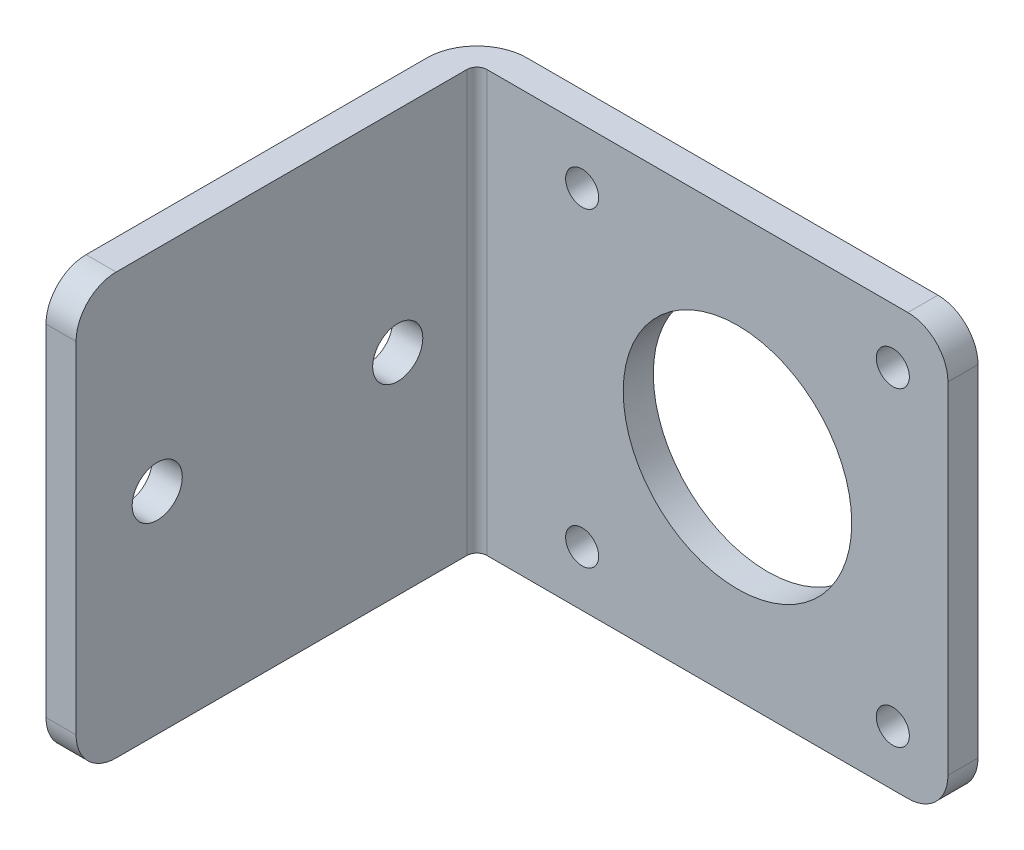
ISO-10303-21;
HEADER;
FILE_DESCRIPTION(('STEP AP214'),'2;1');
FILE_NAME('part.step','',(''),(''),'','','');
FILE_SCHEMA(('AUTOMOTIVE_DESIGN { 1 0 10303 214 1 1 1 1 }'));
ENDSEC;
DATA;
#1=APPLICATION_CONTEXT('core data for automotive mechanical design processes');
#2=APPLICATION_PROTOCOL_DEFINITION('international standard','automotive_design',2000,#1);
#3=PRODUCT_CONTEXT('',#1,'mechanical');
#4=PRODUCT('Part','Part','',(#3));
#5=PRODUCT_RELATED_PRODUCT_CATEGORY('part','',(#4));
#6=PRODUCT_DEFINITION_FORMATION('','',#4);
#7=PRODUCT_DEFINITION_CONTEXT('part definition',#1,'design');
#8=PRODUCT_DEFINITION('design','',#6,#7);
#9=PRODUCT_DEFINITION_SHAPE('','',#8);
#10=(LENGTH_UNIT() NAMED_UNIT(*) SI_UNIT(.MILLI.,.METRE.));
#11=(NAMED_UNIT(*) PLANE_ANGLE_UNIT() SI_UNIT($,.RADIAN.));
#12=(NAMED_UNIT(*) SI_UNIT($,.STERADIAN.) SOLID_ANGLE_UNIT());
#13=UNCERTAINTY_MEASURE_WITH_UNIT(LENGTH_MEASURE(1.E-05),#10,'distance_accuracy_value','');
#14=(GEOMETRIC_REPRESENTATION_CONTEXT(3) GLOBAL_UNCERTAINTY_ASSIGNED_CONTEXT((#13)) GLOBAL_UNIT_ASSIGNED_CONTEXT((#10,
#11,#12)) REPRESENTATION_CONTEXT('',''));
#15=CARTESIAN_POINT('',(0.,0.,0.));
#16=DIRECTION('',(0.,0.,1.));
#17=DIRECTION('',(1.,0.,0.));
#18=AXIS2_PLACEMENT_3D('',#15,#16,#17);
#19=CARTESIAN_POINT('',(0.,21.,3.));
#20=DIRECTION('',(0.,0.,-1.));
#21=DIRECTION('',(-1.,0.,0.));
#22=AXIS2_PLACEMENT_3D('',#19,#20,#21);
#23=PLANE('',#22);
#24=CARTESIAN_POINT('',(44.5,-15.5,3.));
#25=DIRECTION('',(0.,0.,1.));
#26=DIRECTION('',(1.,0.,0.));
#27=AXIS2_PLACEMENT_3D('',#24,#25,#26);
#28=CIRCLE('',#27,1.65);
#29=CARTESIAN_POINT('',(46.15,-15.5,3.));
#30=VERTEX_POINT('',#29);
#31=EDGE_CURVE('E316',#30,#30,#28,.T.);
#32=ORIENTED_EDGE('',*,*,#31,.F.);
#33=EDGE_LOOP('',(#32));
#34=FACE_BOUND('',#33,.T.);
#35=CARTESIAN_POINT('',(13.5,-15.5,3.));
#36=DIRECTION('',(0.,0.,1.));
#37=DIRECTION('',(1.,0.,0.));
#38=AXIS2_PLACEMENT_3D('',#35,#36,#37);
#39=CIRCLE('',#38,1.65);
#40=CARTESIAN_POINT('',(15.15,-15.5,3.));
#41=VERTEX_POINT('',#40);
#42=EDGE_CURVE('E321',#41,#41,#39,.T.);
#43=ORIENTED_EDGE('',*,*,#42,.F.);
#44=EDGE_LOOP('',(#43));
#45=FACE_BOUND('',#44,.T.);
#46=CARTESIAN_POINT('',(44.5,15.5,3.));
#47=DIRECTION('',(0.,0.,1.));
#48=DIRECTION('',(1.,0.,0.));
#49=AXIS2_PLACEMENT_3D('',#46,#47,#48);
#50=CIRCLE('',#49,1.65);
#51=CARTESIAN_POINT('',(46.15,15.5,3.));
#52=VERTEX_POINT('',#51);
#53=EDGE_CURVE('E325',#52,#52,#50,.T.);
#54=ORIENTED_EDGE('',*,*,#53,.F.);
#55=EDGE_LOOP('',(#54));
#56=FACE_BOUND('',#55,.T.);
#57=CARTESIAN_POINT('',(13.5,15.5,3.));
#58=DIRECTION('',(0.,0.,1.));
#59=DIRECTION('',(1.,0.,0.));
#60=AXIS2_PLACEMENT_3D('',#57,#58,#59);
#61=CIRCLE('',#60,1.65);
#62=CARTESIAN_POINT('',(15.15,15.5,3.));
#63=VERTEX_POINT('',#62);
#64=EDGE_CURVE('E329',#63,#63,#61,.T.);
#65=ORIENTED_EDGE('',*,*,#64,.F.);
#66=EDGE_LOOP('',(#65));
#67=FACE_BOUND('',#66,.T.);
#68=CARTESIAN_POINT('',(29.,0.,3.));
#69=DIRECTION('',(0.,0.,1.));
#70=DIRECTION('',(1.,0.,0.));
#71=AXIS2_PLACEMENT_3D('',#68,#69,#70);
#72=CIRCLE('',#71,11.4);
#73=CARTESIAN_POINT('',(40.4,0.,3.));
#74=VERTEX_POINT('',#73);
#75=EDGE_CURVE('E239',#74,#74,#72,.T.);
#76=ORIENTED_EDGE('',*,*,#75,.F.);
#77=EDGE_LOOP('',(#76));
#78=FACE_BOUND('',#77,.T.);
#79=DIRECTION('',(1.,0.,0.));
#80=VECTOR('',#79,1.);
#81=CARTESIAN_POINT('',(0.,21.,3.));
#82=LINE('',#81,#80);
#83=CARTESIAN_POINT('',(4.,21.,3.));
#84=VERTEX_POINT('',#83);
#85=CARTESIAN_POINT('',(46.,21.,3.));
#86=VERTEX_POINT('',#85);
#87=EDGE_CURVE('E219',#84,#86,#82,.T.);
#88=ORIENTED_EDGE('',*,*,#87,.F.);
#89=DIRECTION('',(0.,-1.,0.));
#90=VECTOR('',#89,1.);
#91=CARTESIAN_POINT('',(4.,-21.,3.));
#92=LINE('',#91,#90);
#93=CARTESIAN_POINT('',(4.,-21.,3.));
#94=VERTEX_POINT('',#93);
#95=EDGE_CURVE('E127',#84,#94,#92,.T.);
#96=ORIENTED_EDGE('',*,*,#95,.T.);
#97=DIRECTION('',(1.,0.,0.));
#98=VECTOR('',#97,1.);
#99=CARTESIAN_POINT('',(0.,-21.,3.));
#100=LINE('',#99,#98);
#101=CARTESIAN_POINT('',(46.,-21.,3.));
#102=VERTEX_POINT('',#101);
#103=EDGE_CURVE('E120',#94,#102,#100,.T.);
#104=ORIENTED_EDGE('',*,*,#103,.T.);
#105=CARTESIAN_POINT('',(46.,-17.,3.));
#106=DIRECTION('',(0.,0.,-1.));
#107=DIRECTION('',(-1.,0.,0.));
#108=AXIS2_PLACEMENT_3D('',#105,#106,#107);
#109=CIRCLE('',#108,4.);
#110=CARTESIAN_POINT('',(50.,-17.,3.));
#111=VERTEX_POINT('',#110);
#112=EDGE_CURVE('E124',#102,#111,#109,.F.);
#113=ORIENTED_EDGE('',*,*,#112,.T.);
#114=DIRECTION('',(0.,-1.,0.));
#115=VECTOR('',#114,1.);
#116=CARTESIAN_POINT('',(50.,21.,3.));
#117=LINE('',#116,#115);
#118=CARTESIAN_POINT('',(50.,17.,3.));
#119=VERTEX_POINT('',#118);
#120=EDGE_CURVE('E151',#119,#111,#117,.T.);
#121=ORIENTED_EDGE('',*,*,#120,.F.);
#122=CARTESIAN_POINT('',(46.,17.,3.));
#123=DIRECTION('',(0.,0.,-1.));
#124=DIRECTION('',(-1.,0.,0.));
#125=AXIS2_PLACEMENT_3D('',#122,#123,#124);
#126=CIRCLE('',#125,4.);
#127=EDGE_CURVE('E140',#119,#86,#126,.F.);
#128=ORIENTED_EDGE('',*,*,#127,.T.);
#129=EDGE_LOOP('',(#88,#96,#104,#113,#121,#128));
#130=FACE_BOUND('',#129,.T.);
#131=ADVANCED_FACE('F32',(#34,#45,#56,#67,#78,#130),#23,.F.);
#132=CARTESIAN_POINT('',(50.,21.,0.));
#133=DIRECTION('',(1.,0.,0.));
#134=DIRECTION('',(0.,0.,-1.));
#135=AXIS2_PLACEMENT_3D('',#132,#133,#134);
#136=PLANE('',#135);
#137=ORIENTED_EDGE('',*,*,#120,.T.);
#138=DIRECTION('',(0.,0.,1.));
#139=VECTOR('',#138,1.);
#140=CARTESIAN_POINT('',(50.,-17.,0.));
#141=LINE('',#140,#139);
#142=CARTESIAN_POINT('',(50.,-17.,0.));
#143=VERTEX_POINT('',#142);
#144=EDGE_CURVE('E138',#111,#143,#141,.F.);
#145=ORIENTED_EDGE('',*,*,#144,.T.);
#146=DIRECTION('',(0.,-1.,0.));
#147=VECTOR('',#146,1.);
#148=CARTESIAN_POINT('',(50.,21.,0.));
#149=LINE('',#148,#147);
#150=CARTESIAN_POINT('',(50.,17.,0.));
#151=VERTEX_POINT('',#150);
#152=EDGE_CURVE('E226',#151,#143,#149,.T.);
#153=ORIENTED_EDGE('',*,*,#152,.F.);
#154=DIRECTION('',(0.,0.,1.));
#155=VECTOR('',#154,1.);
#156=CARTESIAN_POINT('',(50.,17.,3.));
#157=LINE('',#156,#155);
#158=EDGE_CURVE('E139',#151,#119,#157,.T.);
#159=ORIENTED_EDGE('',*,*,#158,.T.);
#160=EDGE_LOOP('',(#137,#145,#153,#159));
#161=FACE_BOUND('',#160,.T.);
#162=ADVANCED_FACE('F228',(#161),#136,.T.);
#163=CARTESIAN_POINT('',(0.,21.,0.));
#164=DIRECTION('',(0.,0.,-1.));
#165=DIRECTION('',(-1.,0.,0.));
#166=AXIS2_PLACEMENT_3D('',#163,#164,#165);
#167=PLANE('',#166);
#168=CARTESIAN_POINT('',(44.5,-15.5,0.));
#169=DIRECTION('',(0.,0.,1.));
#170=DIRECTION('',(1.,0.,0.));
#171=AXIS2_PLACEMENT_3D('',#168,#169,#170);
#172=CIRCLE('',#171,1.65);
#173=CARTESIAN_POINT('',(46.15,-15.5,0.));
#174=VERTEX_POINT('',#173);
#175=EDGE_CURVE('E298',#174,#174,#172,.T.);
#176=ORIENTED_EDGE('',*,*,#175,.T.);
#177=EDGE_LOOP('',(#176));
#178=FACE_BOUND('',#177,.T.);
#179=CARTESIAN_POINT('',(13.5,-15.5,0.));
#180=DIRECTION('',(0.,0.,1.));
#181=DIRECTION('',(1.,0.,0.));
#182=AXIS2_PLACEMENT_3D('',#179,#180,#181);
#183=CIRCLE('',#182,1.65);
#184=CARTESIAN_POINT('',(15.15,-15.5,0.));
#185=VERTEX_POINT('',#184);
#186=EDGE_CURVE('E302',#185,#185,#183,.T.);
#187=ORIENTED_EDGE('',*,*,#186,.T.);
#188=EDGE_LOOP('',(#187));
#189=FACE_BOUND('',#188,.T.);
#190=CARTESIAN_POINT('',(44.5,15.5,0.));
#191=DIRECTION('',(0.,0.,1.));
#192=DIRECTION('',(1.,0.,0.));
#193=AXIS2_PLACEMENT_3D('',#190,#191,#192);
#194=CIRCLE('',#193,1.65);
#195=CARTESIAN_POINT('',(46.15,15.5,0.));
#196=VERTEX_POINT('',#195);
#197=EDGE_CURVE('E306',#196,#196,#194,.T.);
#198=ORIENTED_EDGE('',*,*,#197,.T.);
#199=EDGE_LOOP('',(#198));
#200=FACE_BOUND('',#199,.T.);
#201=CARTESIAN_POINT('',(13.5,15.5,0.));
#202=DIRECTION('',(0.,0.,1.));
#203=DIRECTION('',(1.,0.,0.));
#204=AXIS2_PLACEMENT_3D('',#201,#202,#203);
#205=CIRCLE('',#204,1.65);
#206=CARTESIAN_POINT('',(15.15,15.5,0.));
#207=VERTEX_POINT('',#206);
#208=EDGE_CURVE('E310',#207,#207,#205,.T.);
#209=ORIENTED_EDGE('',*,*,#208,.T.);
#210=EDGE_LOOP('',(#209));
#211=FACE_BOUND('',#210,.T.);
#212=CARTESIAN_POINT('',(29.,0.,0.));
#213=DIRECTION('',(0.,0.,1.));
#214=DIRECTION('',(1.,0.,0.));
#215=AXIS2_PLACEMENT_3D('',#212,#213,#214);
#216=CIRCLE('',#215,11.4);
#217=CARTESIAN_POINT('',(40.4,0.,0.));
#218=VERTEX_POINT('',#217);
#219=EDGE_CURVE('E130',#218,#218,#216,.T.);
#220=ORIENTED_EDGE('',*,*,#219,.T.);
#221=EDGE_LOOP('',(#220));
#222=FACE_BOUND('',#221,.T.);
#223=DIRECTION('',(1.,0.,0.));
#224=VECTOR('',#223,1.);
#225=CARTESIAN_POINT('',(0.,-21.,0.));
#226=LINE('',#225,#224);
#227=CARTESIAN_POINT('',(5.,-21.,0.));
#228=VERTEX_POINT('',#227);
#229=CARTESIAN_POINT('',(46.,-21.,0.));
#230=VERTEX_POINT('',#229);
#231=EDGE_CURVE('E129',#228,#230,#226,.T.);
#232=ORIENTED_EDGE('',*,*,#231,.F.);
#233=DIRECTION('',(0.,-1.,0.));
#234=VECTOR('',#233,1.);
#235=CARTESIAN_POINT('',(5.,21.,0.));
#236=LINE('',#235,#234);
#237=CARTESIAN_POINT('',(5.,21.,0.));
#238=VERTEX_POINT('',#237);
#239=EDGE_CURVE('E185',#228,#238,#236,.F.);
#240=ORIENTED_EDGE('',*,*,#239,.T.);
#241=DIRECTION('',(1.,0.,0.));
#242=VECTOR('',#241,1.);
#243=CARTESIAN_POINT('',(0.,21.,0.));
#244=LINE('',#243,#242);
#245=CARTESIAN_POINT('',(46.,21.,0.));
#246=VERTEX_POINT('',#245);
#247=EDGE_CURVE('E198',#238,#246,#244,.T.);
#248=ORIENTED_EDGE('',*,*,#247,.T.);
#249=CARTESIAN_POINT('',(46.,17.,0.));
#250=DIRECTION('',(0.,0.,-1.));
#251=DIRECTION('',(-1.,0.,0.));
#252=AXIS2_PLACEMENT_3D('',#249,#250,#251);
#253=CIRCLE('',#252,4.);
#254=EDGE_CURVE('E158',#246,#151,#253,.T.);
#255=ORIENTED_EDGE('',*,*,#254,.T.);
#256=ORIENTED_EDGE('',*,*,#152,.T.);
#257=CARTESIAN_POINT('',(46.,-17.,0.));
#258=DIRECTION('',(0.,0.,-1.));
#259=DIRECTION('',(-1.,0.,0.));
#260=AXIS2_PLACEMENT_3D('',#257,#258,#259);
#261=CIRCLE('',#260,4.);
#262=EDGE_CURVE('E160',#143,#230,#261,.T.);
#263=ORIENTED_EDGE('',*,*,#262,.T.);
#264=EDGE_LOOP('',(#232,#240,#248,#255,#256,#263));
#265=FACE_BOUND('',#264,.T.);
#266=ADVANCED_FACE('F211',(#178,#189,#200,#211,#222,#265),#167,.T.);
#267=CARTESIAN_POINT('',(0.,21.,43.));
#268=DIRECTION('',(-1.,0.,0.));
#269=DIRECTION('',(0.,0.,1.));
#270=AXIS2_PLACEMENT_3D('',#267,#268,#269);
#271=PLANE('',#270);
#272=CARTESIAN_POINT('',(0.,0.,34.9));
#273=DIRECTION('',(1.,0.,0.));
#274=DIRECTION('',(0.,0.,-1.));
#275=AXIS2_PLACEMENT_3D('',#272,#273,#274);
#276=CIRCLE('',#275,2.5);
#277=CARTESIAN_POINT('',(0.,0.,32.4));
#278=VERTEX_POINT('',#277);
#279=EDGE_CURVE('E319',#278,#278,#276,.T.);
#280=ORIENTED_EDGE('',*,*,#279,.T.);
#281=EDGE_LOOP('',(#280));
#282=FACE_BOUND('',#281,.T.);
#283=CARTESIAN_POINT('',(0.,0.,10.9));
#284=DIRECTION('',(1.,0.,0.));
#285=DIRECTION('',(0.,0.,-1.));
#286=AXIS2_PLACEMENT_3D('',#283,#284,#285);
#287=CIRCLE('',#286,2.5);
#288=CARTESIAN_POINT('',(0.,0.,8.4));
#289=VERTEX_POINT('',#288);
#290=EDGE_CURVE('E336',#289,#289,#287,.T.);
#291=ORIENTED_EDGE('',*,*,#290,.T.);
#292=EDGE_LOOP('',(#291));
#293=FACE_BOUND('',#292,.T.);
#294=DIRECTION('',(0.,0.,-1.));
#295=VECTOR('',#294,1.);
#296=CARTESIAN_POINT('',(0.,21.,43.));
#297=LINE('',#296,#295);
#298=CARTESIAN_POINT('',(0.,21.,39.));
#299=VERTEX_POINT('',#298);
#300=CARTESIAN_POINT('',(0.,21.,5.));
#301=VERTEX_POINT('',#300);
#302=EDGE_CURVE('E196',#299,#301,#297,.T.);
#303=ORIENTED_EDGE('',*,*,#302,.T.);
#304=DIRECTION('',(0.,-1.,0.));
#305=VECTOR('',#304,1.);
#306=CARTESIAN_POINT('',(0.,21.,5.));
#307=LINE('',#306,#305);
#308=CARTESIAN_POINT('',(0.,-21.,5.));
#309=VERTEX_POINT('',#308);
#310=EDGE_CURVE('E180',#301,#309,#307,.T.);
#311=ORIENTED_EDGE('',*,*,#310,.T.);
#312=DIRECTION('',(0.,0.,-1.));
#313=VECTOR('',#312,1.);
#314=CARTESIAN_POINT('',(0.,-21.,43.));
#315=LINE('',#314,#313);
#316=CARTESIAN_POINT('',(0.,-21.,39.));
#317=VERTEX_POINT('',#316);
#318=EDGE_CURVE('E209',#317,#309,#315,.T.);
#319=ORIENTED_EDGE('',*,*,#318,.F.);
#320=CARTESIAN_POINT('',(0.,-17.,39.));
#321=DIRECTION('',(-1.,0.,0.));
#322=DIRECTION('',(0.,0.,1.));
#323=AXIS2_PLACEMENT_3D('',#320,#321,#322);
#324=CIRCLE('',#323,4.);
#325=CARTESIAN_POINT('',(0.,-17.,43.));
#326=VERTEX_POINT('',#325);
#327=EDGE_CURVE('E169',#317,#326,#324,.T.);
#328=ORIENTED_EDGE('',*,*,#327,.T.);
#329=DIRECTION('',(0.,-1.,0.));
#330=VECTOR('',#329,1.);
#331=CARTESIAN_POINT('',(0.,21.,43.));
#332=LINE('',#331,#330);
#333=CARTESIAN_POINT('',(0.,17.,43.));
#334=VERTEX_POINT('',#333);
#335=EDGE_CURVE('E223',#334,#326,#332,.T.);
#336=ORIENTED_EDGE('',*,*,#335,.F.);
#337=CARTESIAN_POINT('',(0.,17.,39.));
#338=DIRECTION('',(-1.,0.,0.));
#339=DIRECTION('',(0.,0.,1.));
#340=AXIS2_PLACEMENT_3D('',#337,#338,#339);
#341=CIRCLE('',#340,4.);
#342=EDGE_CURVE('E167',#334,#299,#341,.T.);
#343=ORIENTED_EDGE('',*,*,#342,.T.);
#344=EDGE_LOOP('',(#303,#311,#319,#328,#336,#343));
#345=FACE_BOUND('',#344,.T.);
#346=ADVANCED_FACE('F203',(#282,#293,#345),#271,.T.);
#347=CARTESIAN_POINT('',(3.,21.,43.));
#348=DIRECTION('',(0.,0.,1.));
#349=DIRECTION('',(1.,0.,0.));
#350=AXIS2_PLACEMENT_3D('',#347,#348,#349);
#351=PLANE('',#350);
#352=ORIENTED_EDGE('',*,*,#335,.T.);
#353=DIRECTION('',(-1.,0.,0.));
#354=VECTOR('',#353,1.);
#355=CARTESIAN_POINT('',(3.,-17.,43.));
#356=LINE('',#355,#354);
#357=CARTESIAN_POINT('',(3.,-17.,43.));
#358=VERTEX_POINT('',#357);
#359=EDGE_CURVE('E174',#326,#358,#356,.F.);
#360=ORIENTED_EDGE('',*,*,#359,.T.);
#361=DIRECTION('',(0.,-1.,0.));
#362=VECTOR('',#361,1.);
#363=CARTESIAN_POINT('',(3.,21.,43.));
#364=LINE('',#363,#362);
#365=CARTESIAN_POINT('',(3.,17.,43.));
#366=VERTEX_POINT('',#365);
#367=EDGE_CURVE('E220',#366,#358,#364,.T.);
#368=ORIENTED_EDGE('',*,*,#367,.F.);
#369=DIRECTION('',(-1.,0.,0.));
#370=VECTOR('',#369,1.);
#371=CARTESIAN_POINT('',(0.,17.,43.));
#372=LINE('',#371,#370);
#373=EDGE_CURVE('E171',#366,#334,#372,.T.);
#374=ORIENTED_EDGE('',*,*,#373,.T.);
#375=EDGE_LOOP('',(#352,#360,#368,#374));
#376=FACE_BOUND('',#375,.T.);
#377=ADVANCED_FACE('F277',(#376),#351,.T.);
#378=CARTESIAN_POINT('',(3.,21.,43.));
#379=DIRECTION('',(-1.,0.,0.));
#380=DIRECTION('',(0.,0.,1.));
#381=AXIS2_PLACEMENT_3D('',#378,#379,#380);
#382=PLANE('',#381);
#383=CARTESIAN_POINT('',(3.,0.,34.9));
#384=DIRECTION('',(1.,0.,0.));
#385=DIRECTION('',(0.,0.,-1.));
#386=AXIS2_PLACEMENT_3D('',#383,#384,#385);
#387=CIRCLE('',#386,2.5);
#388=CARTESIAN_POINT('',(3.,0.,32.4));
#389=VERTEX_POINT('',#388);
#390=EDGE_CURVE('E339',#389,#389,#387,.T.);
#391=ORIENTED_EDGE('',*,*,#390,.F.);
#392=EDGE_LOOP('',(#391));
#393=FACE_BOUND('',#392,.T.);
#394=CARTESIAN_POINT('',(3.,0.,10.9));
#395=DIRECTION('',(1.,0.,0.));
#396=DIRECTION('',(0.,0.,-1.));
#397=AXIS2_PLACEMENT_3D('',#394,#395,#396);
#398=CIRCLE('',#397,2.5);
#399=CARTESIAN_POINT('',(3.,0.,8.4));
#400=VERTEX_POINT('',#399);
#401=EDGE_CURVE('E333',#400,#400,#398,.T.);
#402=ORIENTED_EDGE('',*,*,#401,.F.);
#403=EDGE_LOOP('',(#402));
#404=FACE_BOUND('',#403,.T.);
#405=DIRECTION('',(0.,0.,-1.));
#406=VECTOR('',#405,1.);
#407=CARTESIAN_POINT('',(3.,-21.,43.));
#408=LINE('',#407,#406);
#409=CARTESIAN_POINT('',(3.,-21.,39.));
#410=VERTEX_POINT('',#409);
#411=CARTESIAN_POINT('',(3.,-21.,4.));
#412=VERTEX_POINT('',#411);
#413=EDGE_CURVE('E214',#410,#412,#408,.T.);
#414=ORIENTED_EDGE('',*,*,#413,.T.);
#415=DIRECTION('',(0.,-1.,0.));
#416=VECTOR('',#415,1.);
#417=CARTESIAN_POINT('',(3.,21.,4.));
#418=LINE('',#417,#416);
#419=CARTESIAN_POINT('',(3.,21.,4.));
#420=VERTEX_POINT('',#419);
#421=EDGE_CURVE('E47',#412,#420,#418,.F.);
#422=ORIENTED_EDGE('',*,*,#421,.T.);
#423=DIRECTION('',(0.,0.,-1.));
#424=VECTOR('',#423,1.);
#425=CARTESIAN_POINT('',(3.,21.,43.));
#426=LINE('',#425,#424);
#427=CARTESIAN_POINT('',(3.,21.,39.));
#428=VERTEX_POINT('',#427);
#429=EDGE_CURVE('E206',#428,#420,#426,.T.);
#430=ORIENTED_EDGE('',*,*,#429,.F.);
#431=CARTESIAN_POINT('',(3.,17.,39.));
#432=DIRECTION('',(-1.,0.,0.));
#433=DIRECTION('',(0.,0.,1.));
#434=AXIS2_PLACEMENT_3D('',#431,#432,#433);
#435=CIRCLE('',#434,4.);
#436=EDGE_CURVE('E176',#428,#366,#435,.F.);
#437=ORIENTED_EDGE('',*,*,#436,.T.);
#438=ORIENTED_EDGE('',*,*,#367,.T.);
#439=CARTESIAN_POINT('',(3.,-17.,39.));
#440=DIRECTION('',(-1.,0.,0.));
#441=DIRECTION('',(0.,0.,1.));
#442=AXIS2_PLACEMENT_3D('',#439,#440,#441);
#443=CIRCLE('',#442,4.);
#444=EDGE_CURVE('E178',#358,#410,#443,.F.);
#445=ORIENTED_EDGE('',*,*,#444,.T.);
#446=EDGE_LOOP('',(#414,#422,#430,#437,#438,#445));
#447=FACE_BOUND('',#446,.T.);
#448=ADVANCED_FACE('F274',(#393,#404,#447),#382,.F.);
#449=CARTESIAN_POINT('',(0.,21.,0.));
#450=DIRECTION('',(0.,-1.,0.));
#451=DIRECTION('',(-1.,0.,0.));
#452=AXIS2_PLACEMENT_3D('',#449,#450,#451);
#453=PLANE('',#452);
#454=ORIENTED_EDGE('',*,*,#247,.F.);
#455=CARTESIAN_POINT('',(5.,21.,5.));
#456=DIRECTION('',(0.,-1.,0.));
#457=DIRECTION('',(0.,0.,-1.));
#458=AXIS2_PLACEMENT_3D('',#455,#456,#457);
#459=CIRCLE('',#458,5.);
#460=EDGE_CURVE('E187',#238,#301,#459,.F.);
#461=ORIENTED_EDGE('',*,*,#460,.T.);
#462=ORIENTED_EDGE('',*,*,#302,.F.);
#463=DIRECTION('',(-1.,0.,0.));
#464=VECTOR('',#463,1.);
#465=CARTESIAN_POINT('',(3.,21.,39.));
#466=LINE('',#465,#464);
#467=EDGE_CURVE('E162',#299,#428,#466,.F.);
#468=ORIENTED_EDGE('',*,*,#467,.T.);
#469=ORIENTED_EDGE('',*,*,#429,.T.);
#470=CARTESIAN_POINT('',(4.,21.,4.));
#471=DIRECTION('',(0.,-1.,0.));
#472=DIRECTION('',(0.,0.,-1.));
#473=AXIS2_PLACEMENT_3D('',#470,#471,#472);
#474=CIRCLE('',#473,1.);
#475=EDGE_CURVE('E11',#420,#84,#474,.T.);
#476=ORIENTED_EDGE('',*,*,#475,.T.);
#477=ORIENTED_EDGE('',*,*,#87,.T.);
#478=DIRECTION('',(0.,0.,1.));
#479=VECTOR('',#478,1.);
#480=CARTESIAN_POINT('',(46.,21.,0.));
#481=LINE('',#480,#479);
#482=EDGE_CURVE('E164',#86,#246,#481,.F.);
#483=ORIENTED_EDGE('',*,*,#482,.T.);
#484=EDGE_LOOP('',(#454,#461,#462,#468,#469,#476,#477,#483));
#485=FACE_BOUND('',#484,.T.);
#486=ADVANCED_FACE('F195',(#485),#453,.F.);
#487=CARTESIAN_POINT('',(0.,-21.,0.));
#488=DIRECTION('',(0.,-1.,0.));
#489=DIRECTION('',(-1.,0.,0.));
#490=AXIS2_PLACEMENT_3D('',#487,#488,#489);
#491=PLANE('',#490);
#492=ORIENTED_EDGE('',*,*,#318,.T.);
#493=CARTESIAN_POINT('',(5.,-21.,5.));
#494=DIRECTION('',(0.,-1.,0.));
#495=DIRECTION('',(0.,0.,-1.));
#496=AXIS2_PLACEMENT_3D('',#493,#494,#495);
#497=CIRCLE('',#496,5.);
#498=EDGE_CURVE('E183',#309,#228,#497,.T.);
#499=ORIENTED_EDGE('',*,*,#498,.T.);
#500=ORIENTED_EDGE('',*,*,#231,.T.);
#501=DIRECTION('',(0.,0.,1.));
#502=VECTOR('',#501,1.);
#503=CARTESIAN_POINT('',(46.,-21.,0.));
#504=LINE('',#503,#502);
#505=EDGE_CURVE('E137',#230,#102,#504,.T.);
#506=ORIENTED_EDGE('',*,*,#505,.T.);
#507=ORIENTED_EDGE('',*,*,#103,.F.);
#508=CARTESIAN_POINT('',(4.,-21.,4.));
#509=DIRECTION('',(0.,-1.,0.));
#510=DIRECTION('',(0.,0.,-1.));
#511=AXIS2_PLACEMENT_3D('',#508,#509,#510);
#512=CIRCLE('',#511,1.);
#513=EDGE_CURVE('E40',#94,#412,#512,.F.);
#514=ORIENTED_EDGE('',*,*,#513,.T.);
#515=ORIENTED_EDGE('',*,*,#413,.F.);
#516=DIRECTION('',(-1.,0.,0.));
#517=VECTOR('',#516,1.);
#518=CARTESIAN_POINT('',(0.,-21.,39.));
#519=LINE('',#518,#517);
#520=EDGE_CURVE('E146',#410,#317,#519,.T.);
#521=ORIENTED_EDGE('',*,*,#520,.T.);
#522=EDGE_LOOP('',(#492,#499,#500,#506,#507,#514,#515,#521));
#523=FACE_BOUND('',#522,.T.);
#524=ADVANCED_FACE('F143',(#523),#491,.T.);
#525=CARTESIAN_POINT('',(29.,0.,0.));
#526=DIRECTION('',(0.,0.,1.));
#527=DIRECTION('',(1.,0.,0.));
#528=AXIS2_PLACEMENT_3D('',#525,#526,#527);
#529=CYLINDRICAL_SURFACE('',#528,11.4);
#530=ORIENTED_EDGE('',*,*,#219,.F.);
#531=EDGE_LOOP('',(#530));
#532=FACE_BOUND('',#531,.T.);
#533=ORIENTED_EDGE('',*,*,#75,.T.);
#534=EDGE_LOOP('',(#533));
#535=FACE_BOUND('',#534,.T.);
#536=ADVANCED_FACE('F370',(#532,#535),#529,.F.);
#537=CARTESIAN_POINT('',(13.5,15.5,0.));
#538=DIRECTION('',(0.,0.,1.));
#539=DIRECTION('',(1.,0.,0.));
#540=AXIS2_PLACEMENT_3D('',#537,#538,#539);
#541=CYLINDRICAL_SURFACE('',#540,1.65);
#542=ORIENTED_EDGE('',*,*,#208,.F.);
#543=EDGE_LOOP('',(#542));
#544=FACE_BOUND('',#543,.T.);
#545=ORIENTED_EDGE('',*,*,#64,.T.);
#546=EDGE_LOOP('',(#545));
#547=FACE_BOUND('',#546,.T.);
#548=ADVANCED_FACE('F366',(#544,#547),#541,.F.);
#549=CARTESIAN_POINT('',(44.5,15.5,0.));
#550=DIRECTION('',(0.,0.,1.));
#551=DIRECTION('',(1.,0.,0.));
#552=AXIS2_PLACEMENT_3D('',#549,#550,#551);
#553=CYLINDRICAL_SURFACE('',#552,1.65);
#554=ORIENTED_EDGE('',*,*,#197,.F.);
#555=EDGE_LOOP('',(#554));
#556=FACE_BOUND('',#555,.T.);
#557=ORIENTED_EDGE('',*,*,#53,.T.);
#558=EDGE_LOOP('',(#557));
#559=FACE_BOUND('',#558,.T.);
#560=ADVANCED_FACE('F369',(#556,#559),#553,.F.);
#561=CARTESIAN_POINT('',(13.5,-15.5,0.));
#562=DIRECTION('',(0.,0.,1.));
#563=DIRECTION('',(1.,0.,0.));
#564=AXIS2_PLACEMENT_3D('',#561,#562,#563);
#565=CYLINDRICAL_SURFACE('',#564,1.65);
#566=ORIENTED_EDGE('',*,*,#186,.F.);
#567=EDGE_LOOP('',(#566));
#568=FACE_BOUND('',#567,.T.);
#569=ORIENTED_EDGE('',*,*,#42,.T.);
#570=EDGE_LOOP('',(#569));
#571=FACE_BOUND('',#570,.T.);
#572=ADVANCED_FACE('F361',(#568,#571),#565,.F.);
#573=CARTESIAN_POINT('',(44.5,-15.5,0.));
#574=DIRECTION('',(0.,0.,1.));
#575=DIRECTION('',(1.,0.,0.));
#576=AXIS2_PLACEMENT_3D('',#573,#574,#575);
#577=CYLINDRICAL_SURFACE('',#576,1.65);
#578=ORIENTED_EDGE('',*,*,#175,.F.);
#579=EDGE_LOOP('',(#578));
#580=FACE_BOUND('',#579,.T.);
#581=ORIENTED_EDGE('',*,*,#31,.T.);
#582=EDGE_LOOP('',(#581));
#583=FACE_BOUND('',#582,.T.);
#584=ADVANCED_FACE('F355',(#580,#583),#577,.F.);
#585=CARTESIAN_POINT('',(0.,0.,10.9));
#586=DIRECTION('',(1.,0.,0.));
#587=DIRECTION('',(0.,0.,-1.));
#588=AXIS2_PLACEMENT_3D('',#585,#586,#587);
#589=CYLINDRICAL_SURFACE('',#588,2.5);
#590=ORIENTED_EDGE('',*,*,#290,.F.);
#591=EDGE_LOOP('',(#590));
#592=FACE_BOUND('',#591,.T.);
#593=ORIENTED_EDGE('',*,*,#401,.T.);
#594=EDGE_LOOP('',(#593));
#595=FACE_BOUND('',#594,.T.);
#596=ADVANCED_FACE('F348',(#592,#595),#589,.F.);
#597=CARTESIAN_POINT('',(0.,0.,34.9));
#598=DIRECTION('',(1.,0.,0.));
#599=DIRECTION('',(0.,0.,-1.));
#600=AXIS2_PLACEMENT_3D('',#597,#598,#599);
#601=CYLINDRICAL_SURFACE('',#600,2.5);
#602=ORIENTED_EDGE('',*,*,#279,.F.);
#603=EDGE_LOOP('',(#602));
#604=FACE_BOUND('',#603,.T.);
#605=ORIENTED_EDGE('',*,*,#390,.T.);
#606=EDGE_LOOP('',(#605));
#607=FACE_BOUND('',#606,.T.);
#608=ADVANCED_FACE('F261',(#604,#607),#601,.F.);
#609=CARTESIAN_POINT('',(46.,-17.,0.));
#610=DIRECTION('',(0.,0.,1.));
#611=DIRECTION('',(1.,0.,0.));
#612=AXIS2_PLACEMENT_3D('',#609,#610,#611);
#613=CYLINDRICAL_SURFACE('',#612,4.);
#614=ORIENTED_EDGE('',*,*,#262,.F.);
#615=ORIENTED_EDGE('',*,*,#144,.F.);
#616=ORIENTED_EDGE('',*,*,#112,.F.);
#617=ORIENTED_EDGE('',*,*,#505,.F.);
#618=EDGE_LOOP('',(#614,#615,#616,#617));
#619=FACE_BOUND('',#618,.T.);
#620=ADVANCED_FACE('F136',(#619),#613,.T.);
#621=CARTESIAN_POINT('',(46.,17.,0.));
#622=DIRECTION('',(0.,0.,-1.));
#623=DIRECTION('',(-1.,0.,0.));
#624=AXIS2_PLACEMENT_3D('',#621,#622,#623);
#625=CYLINDRICAL_SURFACE('',#624,4.);
#626=ORIENTED_EDGE('',*,*,#254,.F.);
#627=ORIENTED_EDGE('',*,*,#482,.F.);
#628=ORIENTED_EDGE('',*,*,#127,.F.);
#629=ORIENTED_EDGE('',*,*,#158,.F.);
#630=EDGE_LOOP('',(#626,#627,#628,#629));
#631=FACE_BOUND('',#630,.T.);
#632=ADVANCED_FACE('F234',(#631),#625,.T.);
#633=CARTESIAN_POINT('',(0.,-17.,39.));
#634=DIRECTION('',(-1.,0.,0.));
#635=DIRECTION('',(0.,0.,1.));
#636=AXIS2_PLACEMENT_3D('',#633,#634,#635);
#637=CYLINDRICAL_SURFACE('',#636,4.);
#638=ORIENTED_EDGE('',*,*,#444,.F.);
#639=ORIENTED_EDGE('',*,*,#359,.F.);
#640=ORIENTED_EDGE('',*,*,#327,.F.);
#641=ORIENTED_EDGE('',*,*,#520,.F.);
#642=EDGE_LOOP('',(#638,#639,#640,#641));
#643=FACE_BOUND('',#642,.T.);
#644=ADVANCED_FACE('F264',(#643),#637,.T.);
#645=CARTESIAN_POINT('',(3.,17.,39.));
#646=DIRECTION('',(1.,0.,0.));
#647=DIRECTION('',(0.,0.,-1.));
#648=AXIS2_PLACEMENT_3D('',#645,#646,#647);
#649=CYLINDRICAL_SURFACE('',#648,4.);
#650=ORIENTED_EDGE('',*,*,#436,.F.);
#651=ORIENTED_EDGE('',*,*,#467,.F.);
#652=ORIENTED_EDGE('',*,*,#342,.F.);
#653=ORIENTED_EDGE('',*,*,#373,.F.);
#654=EDGE_LOOP('',(#650,#651,#652,#653));
#655=FACE_BOUND('',#654,.T.);
#656=ADVANCED_FACE('F247',(#655),#649,.T.);
#657=CARTESIAN_POINT('',(5.,21.,5.));
#658=DIRECTION('',(0.,-1.,0.));
#659=DIRECTION('',(0.,0.,-1.));
#660=AXIS2_PLACEMENT_3D('',#657,#658,#659);
#661=CYLINDRICAL_SURFACE('',#660,5.);
#662=ORIENTED_EDGE('',*,*,#460,.F.);
#663=ORIENTED_EDGE('',*,*,#239,.F.);
#664=ORIENTED_EDGE('',*,*,#498,.F.);
#665=ORIENTED_EDGE('',*,*,#310,.F.);
#666=EDGE_LOOP('',(#662,#663,#664,#665));
#667=FACE_BOUND('',#666,.T.);
#668=ADVANCED_FACE('F208',(#667),#661,.T.);
#669=CARTESIAN_POINT('',(4.,21.,4.));
#670=DIRECTION('',(0.,1.,0.));
#671=DIRECTION('',(0.,0.,1.));
#672=AXIS2_PLACEMENT_3D('',#669,#670,#671);
#673=CYLINDRICAL_SURFACE('',#672,1.);
#674=ORIENTED_EDGE('',*,*,#475,.F.);
#675=ORIENTED_EDGE('',*,*,#421,.F.);
#676=ORIENTED_EDGE('',*,*,#513,.F.);
#677=ORIENTED_EDGE('',*,*,#95,.F.);
#678=EDGE_LOOP('',(#674,#675,#676,#677));
#679=FACE_BOUND('',#678,.T.);
#680=ADVANCED_FACE('F34',(#679),#673,.F.);
#681=CLOSED_SHELL('',(#131,#162,#266,#346,#377,#448,#486,#524,#536,#548,#560,#572,#584,#596,
#608,#620,#632,#644,#656,#668,#680));
#682=MANIFOLD_SOLID_BREP('B2',#681);
#683=ADVANCED_BREP_SHAPE_REPRESENTATION('',(#18,#682),#14);
#684=SHAPE_DEFINITION_REPRESENTATION(#9,#683);
ENDSEC;
END-ISO-10303-21;
